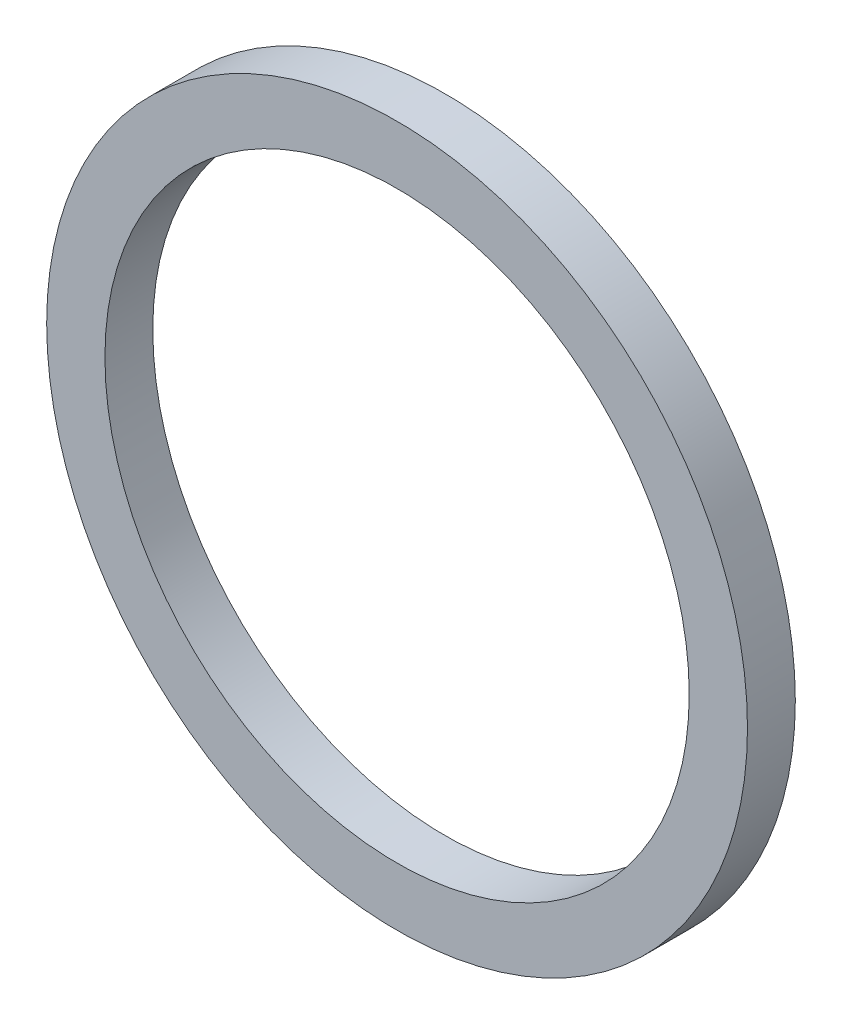
ISO-10303-21;
HEADER;
FILE_DESCRIPTION(('STEP AP214'),'2;1');
FILE_NAME('part.step','',(''),(''),'','','');
FILE_SCHEMA(('AUTOMOTIVE_DESIGN { 1 0 10303 214 1 1 1 1 }'));
ENDSEC;
DATA;
#1=APPLICATION_CONTEXT('core data for automotive mechanical design processes');
#2=APPLICATION_PROTOCOL_DEFINITION('international standard','automotive_design',2000,#1);
#3=PRODUCT_CONTEXT('',#1,'mechanical');
#4=PRODUCT('Part','Part','',(#3));
#5=PRODUCT_RELATED_PRODUCT_CATEGORY('part','',(#4));
#6=PRODUCT_DEFINITION_FORMATION('','',#4);
#7=PRODUCT_DEFINITION_CONTEXT('part definition',#1,'design');
#8=PRODUCT_DEFINITION('design','',#6,#7);
#9=PRODUCT_DEFINITION_SHAPE('','',#8);
#10=(LENGTH_UNIT() NAMED_UNIT(*) SI_UNIT(.MILLI.,.METRE.));
#11=(NAMED_UNIT(*) PLANE_ANGLE_UNIT() SI_UNIT($,.RADIAN.));
#12=(NAMED_UNIT(*) SI_UNIT($,.STERADIAN.) SOLID_ANGLE_UNIT());
#13=UNCERTAINTY_MEASURE_WITH_UNIT(LENGTH_MEASURE(1.E-05),#10,'distance_accuracy_value','');
#14=(GEOMETRIC_REPRESENTATION_CONTEXT(3) GLOBAL_UNCERTAINTY_ASSIGNED_CONTEXT((#13)) GLOBAL_UNIT_ASSIGNED_CONTEXT((#10,
#11,#12)) REPRESENTATION_CONTEXT('',''));
#15=CARTESIAN_POINT('',(0.,0.,0.));
#16=DIRECTION('',(0.,0.,1.));
#17=DIRECTION('',(1.,0.,0.));
#18=AXIS2_PLACEMENT_3D('',#15,#16,#17);
#19=CARTESIAN_POINT('',(15.236510989011,-15.236510989011,4.14734375));
#20=DIRECTION('',(0.,0.,-1.));
#21=DIRECTION('',(0.,-1.,0.));
#22=AXIS2_PLACEMENT_3D('',#19,#20,#21);
#23=PLANE('',#22);
#24=CARTESIAN_POINT('',(0.,0.,4.14734375));
#25=DIRECTION('',(0.,0.,1.));
#26=DIRECTION('',(1.,0.,0.));
#27=AXIS2_PLACEMENT_3D('',#24,#25,#26);
#28=CIRCLE('',#27,11.5486263736264);
#29=CARTESIAN_POINT('',(11.5486263736264,0.,4.14734375));
#30=VERTEX_POINT('',#29);
#31=EDGE_CURVE('E33',#30,#30,#28,.T.);
#32=ORIENTED_EDGE('',*,*,#31,.F.);
#33=EDGE_LOOP('',(#32));
#34=FACE_BOUND('',#33,.T.);
#35=CARTESIAN_POINT('',(0.,0.,4.14734375));
#36=DIRECTION('',(0.,0.,-1.));
#37=DIRECTION('',(1.,0.,0.));
#38=AXIS2_PLACEMENT_3D('',#35,#36,#37);
#39=CIRCLE('',#38,13.8513736263736);
#40=CARTESIAN_POINT('',(13.8513736263736,0.,4.14734375));
#41=VERTEX_POINT('',#40);
#42=EDGE_CURVE('E10',#41,#41,#39,.T.);
#43=ORIENTED_EDGE('',*,*,#42,.F.);
#44=EDGE_LOOP('',(#43));
#45=FACE_BOUND('',#44,.T.);
#46=ADVANCED_FACE('F15',(#34,#45),#23,.F.);
#47=CARTESIAN_POINT('',(-15.236510989011,-15.236510989011,2.25617798111032));
#48=DIRECTION('',(0.,0.,1.));
#49=DIRECTION('',(1.,0.,0.));
#50=AXIS2_PLACEMENT_3D('',#47,#48,#49);
#51=PLANE('',#50);
#52=CARTESIAN_POINT('',(0.,0.,2.25617798111032));
#53=DIRECTION('',(0.,0.,1.));
#54=DIRECTION('',(1.,0.,0.));
#55=AXIS2_PLACEMENT_3D('',#52,#53,#54);
#56=CIRCLE('',#55,11.5486263736264);
#57=CARTESIAN_POINT('',(11.5486263736264,0.,2.25617798111032));
#58=VERTEX_POINT('',#57);
#59=EDGE_CURVE('E39',#58,#58,#56,.T.);
#60=ORIENTED_EDGE('',*,*,#59,.T.);
#61=EDGE_LOOP('',(#60));
#62=FACE_BOUND('',#61,.T.);
#63=CARTESIAN_POINT('',(0.,0.,2.25617798111032));
#64=DIRECTION('',(0.,0.,1.));
#65=DIRECTION('',(1.,0.,0.));
#66=AXIS2_PLACEMENT_3D('',#63,#64,#65);
#67=CIRCLE('',#66,13.8513736263736);
#68=CARTESIAN_POINT('',(13.8513736263736,0.,2.25617798111032));
#69=VERTEX_POINT('',#68);
#70=EDGE_CURVE('E22',#69,#69,#67,.T.);
#71=ORIENTED_EDGE('',*,*,#70,.F.);
#72=EDGE_LOOP('',(#71));
#73=FACE_BOUND('',#72,.T.);
#74=ADVANCED_FACE('F50',(#62,#73),#51,.F.);
#75=CARTESIAN_POINT('',(0.,0.,2.16161969266583));
#76=DIRECTION('',(0.,0.,1.));
#77=DIRECTION('',(1.,0.,0.));
#78=AXIS2_PLACEMENT_3D('',#75,#76,#77);
#79=CYLINDRICAL_SURFACE('',#78,13.8513736263736);
#80=ORIENTED_EDGE('',*,*,#42,.T.);
#81=EDGE_LOOP('',(#80));
#82=FACE_BOUND('',#81,.T.);
#83=ORIENTED_EDGE('',*,*,#70,.T.);
#84=EDGE_LOOP('',(#83));
#85=FACE_BOUND('',#84,.T.);
#86=ADVANCED_FACE('F55',(#82,#85),#79,.T.);
#87=CARTESIAN_POINT('',(0.,0.,2.16161969266583));
#88=DIRECTION('',(0.,0.,1.));
#89=DIRECTION('',(1.,0.,0.));
#90=AXIS2_PLACEMENT_3D('',#87,#88,#89);
#91=CYLINDRICAL_SURFACE('',#90,11.5486263736264);
#92=ORIENTED_EDGE('',*,*,#31,.T.);
#93=EDGE_LOOP('',(#92));
#94=FACE_BOUND('',#93,.T.);
#95=ORIENTED_EDGE('',*,*,#59,.F.);
#96=EDGE_LOOP('',(#95));
#97=FACE_BOUND('',#96,.T.);
#98=ADVANCED_FACE('F49',(#94,#97),#91,.F.);
#99=CLOSED_SHELL('',(#46,#74,#86,#98));
#100=MANIFOLD_SOLID_BREP('B1',#99);
#101=ADVANCED_BREP_SHAPE_REPRESENTATION('',(#18,#100),#14);
#102=SHAPE_DEFINITION_REPRESENTATION(#9,#101);
ENDSEC;
END-ISO-10303-21;
